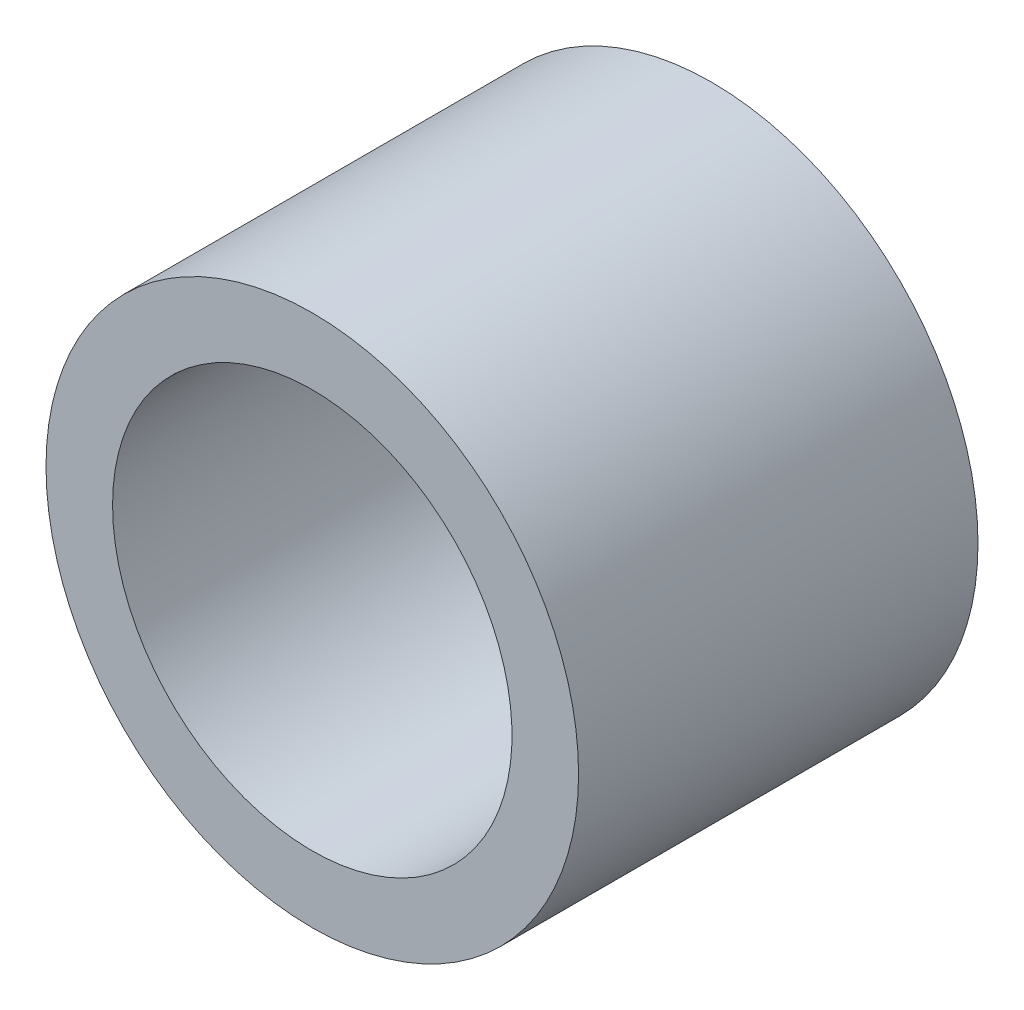
ISO-10303-21;
HEADER;
FILE_DESCRIPTION(('STEP AP214'),'2;1');
FILE_NAME('part.step','',(''),(''),'','','');
FILE_SCHEMA(('AUTOMOTIVE_DESIGN { 1 0 10303 214 1 1 1 1 }'));
ENDSEC;
DATA;
#1=APPLICATION_CONTEXT('core data for automotive mechanical design processes');
#2=APPLICATION_PROTOCOL_DEFINITION('international standard','automotive_design',2000,#1);
#3=PRODUCT_CONTEXT('',#1,'mechanical');
#4=PRODUCT('Part','Part','',(#3));
#5=PRODUCT_RELATED_PRODUCT_CATEGORY('part','',(#4));
#6=PRODUCT_DEFINITION_FORMATION('','',#4);
#7=PRODUCT_DEFINITION_CONTEXT('part definition',#1,'design');
#8=PRODUCT_DEFINITION('design','',#6,#7);
#9=PRODUCT_DEFINITION_SHAPE('','',#8);
#10=(LENGTH_UNIT() NAMED_UNIT(*) SI_UNIT(.MILLI.,.METRE.));
#11=(NAMED_UNIT(*) PLANE_ANGLE_UNIT() SI_UNIT($,.RADIAN.));
#12=(NAMED_UNIT(*) SI_UNIT($,.STERADIAN.) SOLID_ANGLE_UNIT());
#13=UNCERTAINTY_MEASURE_WITH_UNIT(LENGTH_MEASURE(1.E-05),#10,'distance_accuracy_value','');
#14=(GEOMETRIC_REPRESENTATION_CONTEXT(3) GLOBAL_UNCERTAINTY_ASSIGNED_CONTEXT((#13)) GLOBAL_UNIT_ASSIGNED_CONTEXT((#10,
#11,#12)) REPRESENTATION_CONTEXT('',''));
#15=CARTESIAN_POINT('',(0.,0.,0.));
#16=DIRECTION('',(0.,0.,1.));
#17=DIRECTION('',(1.,0.,0.));
#18=AXIS2_PLACEMENT_3D('',#15,#16,#17);
#19=CARTESIAN_POINT('',(0.,0.,9.525));
#20=DIRECTION('',(0.,0.,1.));
#21=DIRECTION('',(1.,0.,0.));
#22=AXIS2_PLACEMENT_3D('',#19,#20,#21);
#23=PLANE('',#22);
#24=CARTESIAN_POINT('',(0.,0.,9.525));
#25=DIRECTION('',(0.,0.,1.));
#26=DIRECTION('',(1.,0.,0.));
#27=AXIS2_PLACEMENT_3D('',#24,#25,#26);
#28=CIRCLE('',#27,6.35);
#29=CARTESIAN_POINT('',(-6.35,0.,9.525));
#30=VERTEX_POINT('',#29);
#31=EDGE_CURVE('E10',#30,#30,#28,.T.);
#32=ORIENTED_EDGE('',*,*,#31,.T.);
#33=EDGE_LOOP('',(#32));
#34=FACE_BOUND('',#33,.T.);
#35=CARTESIAN_POINT('',(0.,0.,9.525));
#36=DIRECTION('',(0.,0.,1.));
#37=DIRECTION('',(1.,0.,0.));
#38=AXIS2_PLACEMENT_3D('',#35,#36,#37);
#39=CIRCLE('',#38,4.7625);
#40=CARTESIAN_POINT('',(-4.7625,0.,9.525));
#41=VERTEX_POINT('',#40);
#42=EDGE_CURVE('E44',#41,#41,#39,.T.);
#43=ORIENTED_EDGE('',*,*,#42,.F.);
#44=EDGE_LOOP('',(#43));
#45=FACE_BOUND('',#44,.T.);
#46=ADVANCED_FACE('F33',(#34,#45),#23,.T.);
#47=CARTESIAN_POINT('',(0.,0.,0.));
#48=DIRECTION('',(0.,0.,1.));
#49=DIRECTION('',(1.,0.,0.));
#50=AXIS2_PLACEMENT_3D('',#47,#48,#49);
#51=PLANE('',#50);
#52=CARTESIAN_POINT('',(0.,0.,0.));
#53=DIRECTION('',(0.,0.,1.));
#54=DIRECTION('',(1.,0.,0.));
#55=AXIS2_PLACEMENT_3D('',#52,#53,#54);
#56=CIRCLE('',#55,6.35);
#57=CARTESIAN_POINT('',(-6.35,0.,0.));
#58=VERTEX_POINT('',#57);
#59=EDGE_CURVE('E37',#58,#58,#56,.T.);
#60=ORIENTED_EDGE('',*,*,#59,.F.);
#61=EDGE_LOOP('',(#60));
#62=FACE_BOUND('',#61,.T.);
#63=CARTESIAN_POINT('',(0.,0.,0.));
#64=DIRECTION('',(0.,0.,1.));
#65=DIRECTION('',(1.,0.,0.));
#66=AXIS2_PLACEMENT_3D('',#63,#64,#65);
#67=CIRCLE('',#66,4.7625);
#68=CARTESIAN_POINT('',(-4.7625,0.,0.));
#69=VERTEX_POINT('',#68);
#70=EDGE_CURVE('E46',#69,#69,#67,.T.);
#71=ORIENTED_EDGE('',*,*,#70,.T.);
#72=EDGE_LOOP('',(#71));
#73=FACE_BOUND('',#72,.T.);
#74=ADVANCED_FACE('F56',(#62,#73),#51,.F.);
#75=CARTESIAN_POINT('',(0.,0.,9.525));
#76=DIRECTION('',(0.,0.,-1.));
#77=DIRECTION('',(-1.,0.,0.));
#78=AXIS2_PLACEMENT_3D('',#75,#76,#77);
#79=CYLINDRICAL_SURFACE('',#78,6.35);
#80=CARTESIAN_POINT('',(-6.35,0.,9.525));
#81=CARTESIAN_POINT('',(-6.35,0.,9.42578125));
#82=CARTESIAN_POINT('',(-6.35,0.,9.3265625));
#83=CARTESIAN_POINT('',(-6.35,0.,9.128125));
#84=CARTESIAN_POINT('',(-6.35,0.,9.02890625));
#85=CARTESIAN_POINT('',(-6.35,0.,8.83046875));
#86=CARTESIAN_POINT('',(-6.35,0.,8.73125));
#87=CARTESIAN_POINT('',(-6.35,0.,8.5328125));
#88=CARTESIAN_POINT('',(-6.35,0.,8.43359375));
#89=CARTESIAN_POINT('',(-6.35,0.,8.23515625));
#90=CARTESIAN_POINT('',(-6.35,0.,8.1359375));
#91=CARTESIAN_POINT('',(-6.35,0.,7.9375));
#92=CARTESIAN_POINT('',(-6.35,0.,7.83828125));
#93=CARTESIAN_POINT('',(-6.35,0.,7.63984375));
#94=CARTESIAN_POINT('',(-6.35,0.,7.540625));
#95=CARTESIAN_POINT('',(-6.35,0.,7.3421875));
#96=CARTESIAN_POINT('',(-6.35,0.,7.24296875));
#97=CARTESIAN_POINT('',(-6.35,0.,7.04453125));
#98=CARTESIAN_POINT('',(-6.35,0.,6.9453125));
#99=CARTESIAN_POINT('',(-6.35,0.,6.746875));
#100=CARTESIAN_POINT('',(-6.35,0.,6.64765625));
#101=CARTESIAN_POINT('',(-6.35,0.,6.44921875));
#102=CARTESIAN_POINT('',(-6.35,0.,6.35));
#103=CARTESIAN_POINT('',(-6.35,0.,6.1515625));
#104=CARTESIAN_POINT('',(-6.35,0.,6.05234375));
#105=CARTESIAN_POINT('',(-6.35,0.,5.85390625));
#106=CARTESIAN_POINT('',(-6.35,0.,5.7546875));
#107=CARTESIAN_POINT('',(-6.35,0.,5.55625));
#108=CARTESIAN_POINT('',(-6.35,0.,5.45703125));
#109=CARTESIAN_POINT('',(-6.35,0.,5.25859375));
#110=CARTESIAN_POINT('',(-6.35,0.,5.159375));
#111=CARTESIAN_POINT('',(-6.35,0.,4.9609375));
#112=CARTESIAN_POINT('',(-6.35,0.,4.86171875));
#113=CARTESIAN_POINT('',(-6.35,0.,4.66328125));
#114=CARTESIAN_POINT('',(-6.35,0.,4.5640625));
#115=CARTESIAN_POINT('',(-6.35,0.,4.365625));
#116=CARTESIAN_POINT('',(-6.35,0.,4.26640625));
#117=CARTESIAN_POINT('',(-6.35,0.,4.06796875));
#118=CARTESIAN_POINT('',(-6.35,0.,3.96875));
#119=CARTESIAN_POINT('',(-6.35,0.,3.7703125));
#120=CARTESIAN_POINT('',(-6.35,0.,3.67109375));
#121=CARTESIAN_POINT('',(-6.35,0.,3.47265625));
#122=CARTESIAN_POINT('',(-6.35,0.,3.3734375));
#123=CARTESIAN_POINT('',(-6.35,0.,3.175));
#124=CARTESIAN_POINT('',(-6.35,0.,3.07578125));
#125=CARTESIAN_POINT('',(-6.35,0.,2.87734375));
#126=CARTESIAN_POINT('',(-6.35,0.,2.778125));
#127=CARTESIAN_POINT('',(-6.35,0.,2.5796875));
#128=CARTESIAN_POINT('',(-6.35,0.,2.48046875));
#129=CARTESIAN_POINT('',(-6.35,0.,2.28203125));
#130=CARTESIAN_POINT('',(-6.35,0.,2.1828125));
#131=CARTESIAN_POINT('',(-6.35,0.,1.984375));
#132=CARTESIAN_POINT('',(-6.35,0.,1.88515625));
#133=CARTESIAN_POINT('',(-6.35,0.,1.68671875));
#134=CARTESIAN_POINT('',(-6.35,0.,1.5875));
#135=CARTESIAN_POINT('',(-6.35,0.,1.3890625));
#136=CARTESIAN_POINT('',(-6.35,0.,1.28984375));
#137=CARTESIAN_POINT('',(-6.35,0.,1.09140625));
#138=CARTESIAN_POINT('',(-6.35,0.,0.992187500000001));
#139=CARTESIAN_POINT('',(-6.35,0.,0.793750000000001));
#140=CARTESIAN_POINT('',(-6.35,0.,0.69453125));
#141=CARTESIAN_POINT('',(-6.35,0.,0.49609375));
#142=CARTESIAN_POINT('',(-6.35,0.,0.396875));
#143=CARTESIAN_POINT('',(-6.35,0.,0.1984375));
#144=CARTESIAN_POINT('',(-6.35,0.,0.0992187500000001));
#145=CARTESIAN_POINT('',(-6.35,0.,0.));
#146=B_SPLINE_CURVE_WITH_KNOTS('',3,(#80,#81,#82,#83,#84,#85,#86,#87,#88,#89,#90,#91,#92,#93,
#94,#95,#96,#97,#98,#99,#100,#101,#102,#103,#104,#105,#106,#107,#108,#109,#110,#111,#112,#113,
#114,#115,#116,#117,#118,#119,#120,#121,#122,#123,#124,#125,#126,#127,#128,#129,#130,#131,#132,
#133,#134,#135,#136,#137,#138,#139,#140,#141,#142,#143,#144,#145),.UNSPECIFIED.,.F.,.F.,(4,2,2,
2,2,2,2,2,2,2,2,2,2,2,2,2,2,2,2,2,2,2,2,2,2,2,2,2,2,2,2,2,4),(0.,0.297656249999998,
0.595312499999999,0.892968749999999,1.190625,1.48828125,1.7859375,2.08359375,2.38125,2.67890625,
2.9765625,3.27421875,3.571875,3.86953125,4.1671875,4.46484375,4.7625,5.06015625,5.3578125,
5.65546875,5.953125,6.25078125,6.5484375,6.84609375,7.14375,7.44140625,7.7390625,8.03671875,
8.334375,8.63203125,8.9296875,9.22734375,9.525),.UNSPECIFIED.);
#147=EDGE_CURVE('BSEAM35',#30,#58,#146,.T.);
#148=ORIENTED_EDGE('',*,*,#31,.F.);
#149=ORIENTED_EDGE('',*,*,#59,.T.);
#150=ORIENTED_EDGE('',*,*,#147,.T.);
#151=ORIENTED_EDGE('',*,*,#147,.F.);
#152=EDGE_LOOP('',(#148,#150,#149,#151));
#153=FACE_BOUND('',#152,.T.);
#154=ADVANCED_FACE('F35',(#153),#79,.T.);
#155=CARTESIAN_POINT('',(0.,0.,9.525));
#156=DIRECTION('',(0.,0.,-1.));
#157=DIRECTION('',(-1.,0.,0.));
#158=AXIS2_PLACEMENT_3D('',#155,#156,#157);
#159=CYLINDRICAL_SURFACE('',#158,4.7625);
#160=CARTESIAN_POINT('',(-4.7625,0.,9.525));
#161=CARTESIAN_POINT('',(-4.7625,0.,9.42578125));
#162=CARTESIAN_POINT('',(-4.7625,0.,9.3265625));
#163=CARTESIAN_POINT('',(-4.7625,0.,9.128125));
#164=CARTESIAN_POINT('',(-4.7625,0.,9.02890625));
#165=CARTESIAN_POINT('',(-4.7625,0.,8.83046875));
#166=CARTESIAN_POINT('',(-4.7625,0.,8.73125));
#167=CARTESIAN_POINT('',(-4.7625,0.,8.5328125));
#168=CARTESIAN_POINT('',(-4.7625,0.,8.43359375));
#169=CARTESIAN_POINT('',(-4.7625,0.,8.23515625));
#170=CARTESIAN_POINT('',(-4.7625,0.,8.1359375));
#171=CARTESIAN_POINT('',(-4.7625,0.,7.9375));
#172=CARTESIAN_POINT('',(-4.7625,0.,7.83828125));
#173=CARTESIAN_POINT('',(-4.7625,0.,7.63984375));
#174=CARTESIAN_POINT('',(-4.7625,0.,7.540625));
#175=CARTESIAN_POINT('',(-4.7625,0.,7.3421875));
#176=CARTESIAN_POINT('',(-4.7625,0.,7.24296875));
#177=CARTESIAN_POINT('',(-4.7625,0.,7.04453125));
#178=CARTESIAN_POINT('',(-4.7625,0.,6.9453125));
#179=CARTESIAN_POINT('',(-4.7625,0.,6.746875));
#180=CARTESIAN_POINT('',(-4.7625,0.,6.64765625));
#181=CARTESIAN_POINT('',(-4.7625,0.,6.44921875));
#182=CARTESIAN_POINT('',(-4.7625,0.,6.35));
#183=CARTESIAN_POINT('',(-4.7625,0.,6.1515625));
#184=CARTESIAN_POINT('',(-4.7625,0.,6.05234375));
#185=CARTESIAN_POINT('',(-4.7625,0.,5.85390625));
#186=CARTESIAN_POINT('',(-4.7625,0.,5.7546875));
#187=CARTESIAN_POINT('',(-4.7625,0.,5.55625));
#188=CARTESIAN_POINT('',(-4.7625,0.,5.45703125));
#189=CARTESIAN_POINT('',(-4.7625,0.,5.25859375));
#190=CARTESIAN_POINT('',(-4.7625,0.,5.159375));
#191=CARTESIAN_POINT('',(-4.7625,0.,4.9609375));
#192=CARTESIAN_POINT('',(-4.7625,0.,4.86171875));
#193=CARTESIAN_POINT('',(-4.7625,0.,4.66328125));
#194=CARTESIAN_POINT('',(-4.7625,0.,4.5640625));
#195=CARTESIAN_POINT('',(-4.7625,0.,4.365625));
#196=CARTESIAN_POINT('',(-4.7625,0.,4.26640625));
#197=CARTESIAN_POINT('',(-4.7625,0.,4.06796875));
#198=CARTESIAN_POINT('',(-4.7625,0.,3.96875));
#199=CARTESIAN_POINT('',(-4.7625,0.,3.7703125));
#200=CARTESIAN_POINT('',(-4.7625,0.,3.67109375));
#201=CARTESIAN_POINT('',(-4.7625,0.,3.47265625));
#202=CARTESIAN_POINT('',(-4.7625,0.,3.3734375));
#203=CARTESIAN_POINT('',(-4.7625,0.,3.175));
#204=CARTESIAN_POINT('',(-4.7625,0.,3.07578125));
#205=CARTESIAN_POINT('',(-4.7625,0.,2.87734375));
#206=CARTESIAN_POINT('',(-4.7625,0.,2.778125));
#207=CARTESIAN_POINT('',(-4.7625,0.,2.5796875));
#208=CARTESIAN_POINT('',(-4.7625,0.,2.48046875));
#209=CARTESIAN_POINT('',(-4.7625,0.,2.28203125));
#210=CARTESIAN_POINT('',(-4.7625,0.,2.1828125));
#211=CARTESIAN_POINT('',(-4.7625,0.,1.984375));
#212=CARTESIAN_POINT('',(-4.7625,0.,1.88515625));
#213=CARTESIAN_POINT('',(-4.7625,0.,1.68671875));
#214=CARTESIAN_POINT('',(-4.7625,0.,1.5875));
#215=CARTESIAN_POINT('',(-4.7625,0.,1.3890625));
#216=CARTESIAN_POINT('',(-4.7625,0.,1.28984375));
#217=CARTESIAN_POINT('',(-4.7625,0.,1.09140625));
#218=CARTESIAN_POINT('',(-4.7625,0.,0.992187500000001));
#219=CARTESIAN_POINT('',(-4.7625,0.,0.793750000000001));
#220=CARTESIAN_POINT('',(-4.7625,0.,0.69453125));
#221=CARTESIAN_POINT('',(-4.7625,0.,0.49609375));
#222=CARTESIAN_POINT('',(-4.7625,0.,0.396875));
#223=CARTESIAN_POINT('',(-4.7625,0.,0.1984375));
#224=CARTESIAN_POINT('',(-4.7625,0.,0.0992187500000001));
#225=CARTESIAN_POINT('',(-4.7625,0.,0.));
#226=B_SPLINE_CURVE_WITH_KNOTS('',3,(#160,#161,#162,#163,#164,#165,#166,#167,#168,#169,#170,
#171,#172,#173,#174,#175,#176,#177,#178,#179,#180,#181,#182,#183,#184,#185,#186,#187,#188,#189,
#190,#191,#192,#193,#194,#195,#196,#197,#198,#199,#200,#201,#202,#203,#204,#205,#206,#207,#208,
#209,#210,#211,#212,#213,#214,#215,#216,#217,#218,#219,#220,#221,#222,#223,#224,#225),
.UNSPECIFIED.,.F.,.F.,(4,2,2,2,2,2,2,2,2,2,2,2,2,2,2,2,2,2,2,2,2,2,2,2,2,2,2,2,2,2,2,2,4),(0.,
0.29765625,0.5953125,0.892968750000001,1.190625,1.48828125,1.7859375,2.08359375,2.38125,
2.67890625,2.9765625,3.27421875,3.571875,3.86953125,4.1671875,4.46484375,4.7625,5.06015625,
5.3578125,5.65546875,5.953125,6.25078125,6.5484375,6.84609375,7.14375,7.44140625,7.7390625,
8.03671875,8.334375,8.63203125,8.9296875,9.22734375,9.525),.UNSPECIFIED.);
#227=EDGE_CURVE('BSEAM52',#41,#69,#226,.T.);
#228=ORIENTED_EDGE('',*,*,#42,.T.);
#229=ORIENTED_EDGE('',*,*,#70,.F.);
#230=ORIENTED_EDGE('',*,*,#227,.T.);
#231=ORIENTED_EDGE('',*,*,#227,.F.);
#232=EDGE_LOOP('',(#228,#230,#229,#231));
#233=FACE_BOUND('',#232,.T.);
#234=ADVANCED_FACE('F52',(#233),#159,.F.);
#235=CLOSED_SHELL('',(#46,#74,#154,#234));
#236=MANIFOLD_SOLID_BREP('B2',#235);
#237=ADVANCED_BREP_SHAPE_REPRESENTATION('',(#18,#236),#14);
#238=SHAPE_DEFINITION_REPRESENTATION(#9,#237);
ENDSEC;
END-ISO-10303-21;
